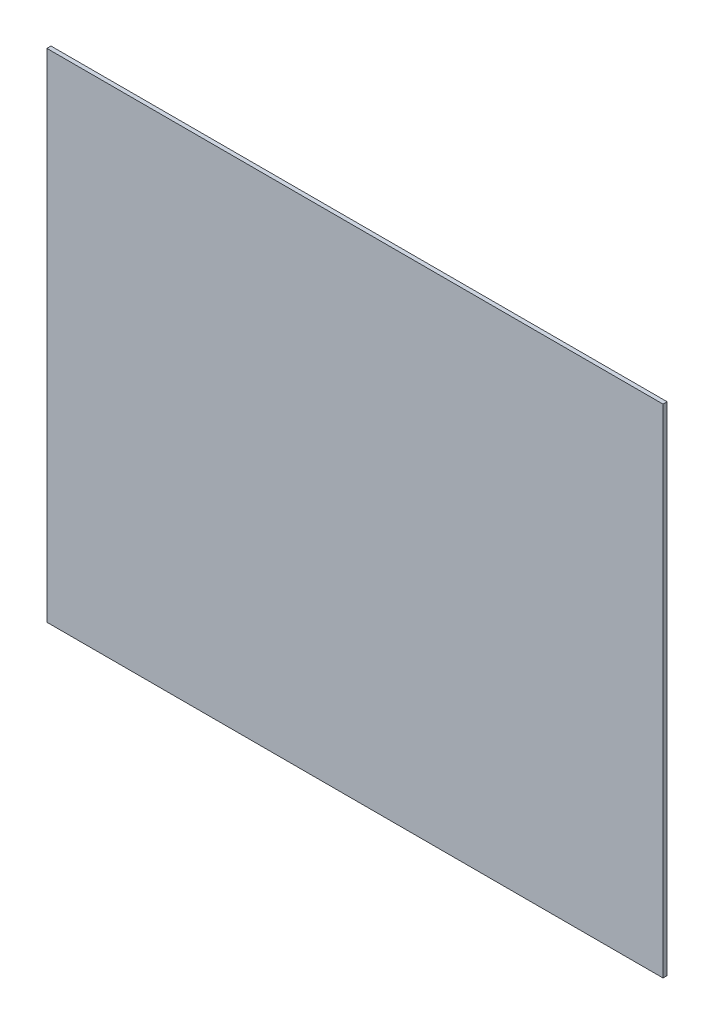
ISO-10303-21;
HEADER;
FILE_DESCRIPTION(('STEP AP214'),'2;1');
FILE_NAME('part.step','',(''),(''),'','','');
FILE_SCHEMA(('AUTOMOTIVE_DESIGN { 1 0 10303 214 1 1 1 1 }'));
ENDSEC;
DATA;
#1=APPLICATION_CONTEXT('core data for automotive mechanical design processes');
#2=APPLICATION_PROTOCOL_DEFINITION('international standard','automotive_design',2000,#1);
#3=PRODUCT_CONTEXT('',#1,'mechanical');
#4=PRODUCT('Part','Part','',(#3));
#5=PRODUCT_RELATED_PRODUCT_CATEGORY('part','',(#4));
#6=PRODUCT_DEFINITION_FORMATION('','',#4);
#7=PRODUCT_DEFINITION_CONTEXT('part definition',#1,'design');
#8=PRODUCT_DEFINITION('design','',#6,#7);
#9=PRODUCT_DEFINITION_SHAPE('','',#8);
#10=(LENGTH_UNIT() NAMED_UNIT(*) SI_UNIT(.MILLI.,.METRE.));
#11=(NAMED_UNIT(*) PLANE_ANGLE_UNIT() SI_UNIT($,.RADIAN.));
#12=(NAMED_UNIT(*) SI_UNIT($,.STERADIAN.) SOLID_ANGLE_UNIT());
#13=UNCERTAINTY_MEASURE_WITH_UNIT(LENGTH_MEASURE(1.E-05),#10,'distance_accuracy_value','');
#14=(GEOMETRIC_REPRESENTATION_CONTEXT(3) GLOBAL_UNCERTAINTY_ASSIGNED_CONTEXT((#13)) GLOBAL_UNIT_ASSIGNED_CONTEXT((#10,
#11,#12)) REPRESENTATION_CONTEXT('',''));
#15=CARTESIAN_POINT('',(0.,0.,0.));
#16=DIRECTION('',(0.,0.,1.));
#17=DIRECTION('',(1.,0.,0.));
#18=AXIS2_PLACEMENT_3D('',#15,#16,#17);
#19=CARTESIAN_POINT('',(238.125,-192.0875,3.175));
#20=DIRECTION('',(-1.,0.,0.));
#21=DIRECTION('',(0.,0.,1.));
#22=AXIS2_PLACEMENT_3D('',#19,#20,#21);
#23=PLANE('',#22);
#24=DIRECTION('',(0.,1.,0.));
#25=VECTOR('',#24,1.);
#26=CARTESIAN_POINT('',(238.125,-192.0875,0.));
#27=LINE('',#26,#25);
#28=CARTESIAN_POINT('',(238.125,-192.0875,0.));
#29=VERTEX_POINT('',#28);
#30=CARTESIAN_POINT('',(238.125,192.0875,0.));
#31=VERTEX_POINT('',#30);
#32=EDGE_CURVE('E107',#29,#31,#27,.T.);
#33=ORIENTED_EDGE('',*,*,#32,.T.);
#34=DIRECTION('',(0.,0.,-1.));
#35=VECTOR('',#34,1.);
#36=CARTESIAN_POINT('',(238.125,192.0875,3.175));
#37=LINE('',#36,#35);
#38=CARTESIAN_POINT('',(238.125,192.0875,3.175));
#39=VERTEX_POINT('',#38);
#40=EDGE_CURVE('E11',#39,#31,#37,.T.);
#41=ORIENTED_EDGE('',*,*,#40,.F.);
#42=DIRECTION('',(0.,1.,0.));
#43=VECTOR('',#42,1.);
#44=CARTESIAN_POINT('',(238.125,-192.0875,3.175));
#45=LINE('',#44,#43);
#46=CARTESIAN_POINT('',(238.125,-192.0875,3.175));
#47=VERTEX_POINT('',#46);
#48=EDGE_CURVE('E91',#47,#39,#45,.T.);
#49=ORIENTED_EDGE('',*,*,#48,.F.);
#50=DIRECTION('',(0.,0.,-1.));
#51=VECTOR('',#50,1.);
#52=CARTESIAN_POINT('',(238.125,-192.0875,3.175));
#53=LINE('',#52,#51);
#54=EDGE_CURVE('E103',#47,#29,#53,.T.);
#55=ORIENTED_EDGE('',*,*,#54,.T.);
#56=EDGE_LOOP('',(#33,#41,#49,#55));
#57=FACE_BOUND('',#56,.T.);
#58=ADVANCED_FACE('F39',(#57),#23,.F.);
#59=CARTESIAN_POINT('',(-238.125,192.0875,3.175));
#60=DIRECTION('',(0.,-1.,0.));
#61=DIRECTION('',(0.,0.,-1.));
#62=AXIS2_PLACEMENT_3D('',#59,#60,#61);
#63=PLANE('',#62);
#64=DIRECTION('',(-1.,0.,0.));
#65=VECTOR('',#64,1.);
#66=CARTESIAN_POINT('',(-238.125,192.0875,0.));
#67=LINE('',#66,#65);
#68=CARTESIAN_POINT('',(-238.125,192.0875,0.));
#69=VERTEX_POINT('',#68);
#70=EDGE_CURVE('E96',#31,#69,#67,.T.);
#71=ORIENTED_EDGE('',*,*,#70,.T.);
#72=DIRECTION('',(0.,0.,-1.));
#73=VECTOR('',#72,1.);
#74=CARTESIAN_POINT('',(-238.125,192.0875,3.175));
#75=LINE('',#74,#73);
#76=CARTESIAN_POINT('',(-238.125,192.0875,3.175));
#77=VERTEX_POINT('',#76);
#78=EDGE_CURVE('E48',#77,#69,#75,.T.);
#79=ORIENTED_EDGE('',*,*,#78,.F.);
#80=DIRECTION('',(-1.,0.,0.));
#81=VECTOR('',#80,1.);
#82=CARTESIAN_POINT('',(-238.125,192.0875,3.175));
#83=LINE('',#82,#81);
#84=EDGE_CURVE('E86',#39,#77,#83,.T.);
#85=ORIENTED_EDGE('',*,*,#84,.F.);
#86=ORIENTED_EDGE('',*,*,#40,.T.);
#87=EDGE_LOOP('',(#71,#79,#85,#86));
#88=FACE_BOUND('',#87,.T.);
#89=ADVANCED_FACE('F95',(#88),#63,.F.);
#90=CARTESIAN_POINT('',(-238.125,-192.0875,3.175));
#91=DIRECTION('',(1.,0.,0.));
#92=DIRECTION('',(0.,0.,-1.));
#93=AXIS2_PLACEMENT_3D('',#90,#91,#92);
#94=PLANE('',#93);
#95=DIRECTION('',(0.,-1.,0.));
#96=VECTOR('',#95,1.);
#97=CARTESIAN_POINT('',(-238.125,-192.0875,0.));
#98=LINE('',#97,#96);
#99=CARTESIAN_POINT('',(-238.125,-192.0875,0.));
#100=VERTEX_POINT('',#99);
#101=EDGE_CURVE('E73',#69,#100,#98,.T.);
#102=ORIENTED_EDGE('',*,*,#101,.T.);
#103=DIRECTION('',(0.,0.,-1.));
#104=VECTOR('',#103,1.);
#105=CARTESIAN_POINT('',(-238.125,-192.0875,3.175));
#106=LINE('',#105,#104);
#107=CARTESIAN_POINT('',(-238.125,-192.0875,3.175));
#108=VERTEX_POINT('',#107);
#109=EDGE_CURVE('E98',#108,#100,#106,.T.);
#110=ORIENTED_EDGE('',*,*,#109,.F.);
#111=DIRECTION('',(0.,-1.,0.));
#112=VECTOR('',#111,1.);
#113=CARTESIAN_POINT('',(-238.125,-192.0875,3.175));
#114=LINE('',#113,#112);
#115=EDGE_CURVE('E89',#77,#108,#114,.T.);
#116=ORIENTED_EDGE('',*,*,#115,.F.);
#117=ORIENTED_EDGE('',*,*,#78,.T.);
#118=EDGE_LOOP('',(#102,#110,#116,#117));
#119=FACE_BOUND('',#118,.T.);
#120=ADVANCED_FACE('F99',(#119),#94,.F.);
#121=CARTESIAN_POINT('',(-238.125,-192.0875,3.175));
#122=DIRECTION('',(0.,1.,0.));
#123=DIRECTION('',(0.,0.,1.));
#124=AXIS2_PLACEMENT_3D('',#121,#122,#123);
#125=PLANE('',#124);
#126=DIRECTION('',(1.,0.,0.));
#127=VECTOR('',#126,1.);
#128=CARTESIAN_POINT('',(-238.125,-192.0875,0.));
#129=LINE('',#128,#127);
#130=EDGE_CURVE('E79',#100,#29,#129,.T.);
#131=ORIENTED_EDGE('',*,*,#130,.T.);
#132=ORIENTED_EDGE('',*,*,#54,.F.);
#133=DIRECTION('',(1.,0.,0.));
#134=VECTOR('',#133,1.);
#135=CARTESIAN_POINT('',(-238.125,-192.0875,3.175));
#136=LINE('',#135,#134);
#137=EDGE_CURVE('E56',#108,#47,#136,.T.);
#138=ORIENTED_EDGE('',*,*,#137,.F.);
#139=ORIENTED_EDGE('',*,*,#109,.T.);
#140=EDGE_LOOP('',(#131,#132,#138,#139));
#141=FACE_BOUND('',#140,.T.);
#142=ADVANCED_FACE('F120',(#141),#125,.F.);
#143=CARTESIAN_POINT('',(0.,0.,3.175));
#144=DIRECTION('',(0.,0.,-1.));
#145=DIRECTION('',(-1.,0.,0.));
#146=AXIS2_PLACEMENT_3D('',#143,#144,#145);
#147=PLANE('',#146);
#148=ORIENTED_EDGE('',*,*,#48,.T.);
#149=ORIENTED_EDGE('',*,*,#84,.T.);
#150=ORIENTED_EDGE('',*,*,#115,.T.);
#151=ORIENTED_EDGE('',*,*,#137,.T.);
#152=EDGE_LOOP('',(#148,#149,#150,#151));
#153=FACE_BOUND('',#152,.T.);
#154=ADVANCED_FACE('F87',(#153),#147,.F.);
#155=CARTESIAN_POINT('',(0.,0.,0.));
#156=DIRECTION('',(0.,0.,-1.));
#157=DIRECTION('',(-1.,0.,0.));
#158=AXIS2_PLACEMENT_3D('',#155,#156,#157);
#159=PLANE('',#158);
#160=ORIENTED_EDGE('',*,*,#32,.F.);
#161=ORIENTED_EDGE('',*,*,#130,.F.);
#162=ORIENTED_EDGE('',*,*,#101,.F.);
#163=ORIENTED_EDGE('',*,*,#70,.F.);
#164=EDGE_LOOP('',(#160,#161,#162,#163));
#165=FACE_BOUND('',#164,.T.);
#166=ADVANCED_FACE('F123',(#165),#159,.T.);
#167=CLOSED_SHELL('',(#58,#89,#120,#142,#154,#166));
#168=MANIFOLD_SOLID_BREP('B2',#167);
#169=ADVANCED_BREP_SHAPE_REPRESENTATION('',(#18,#168),#14);
#170=SHAPE_DEFINITION_REPRESENTATION(#9,#169);
ENDSEC;
END-ISO-10303-21;
